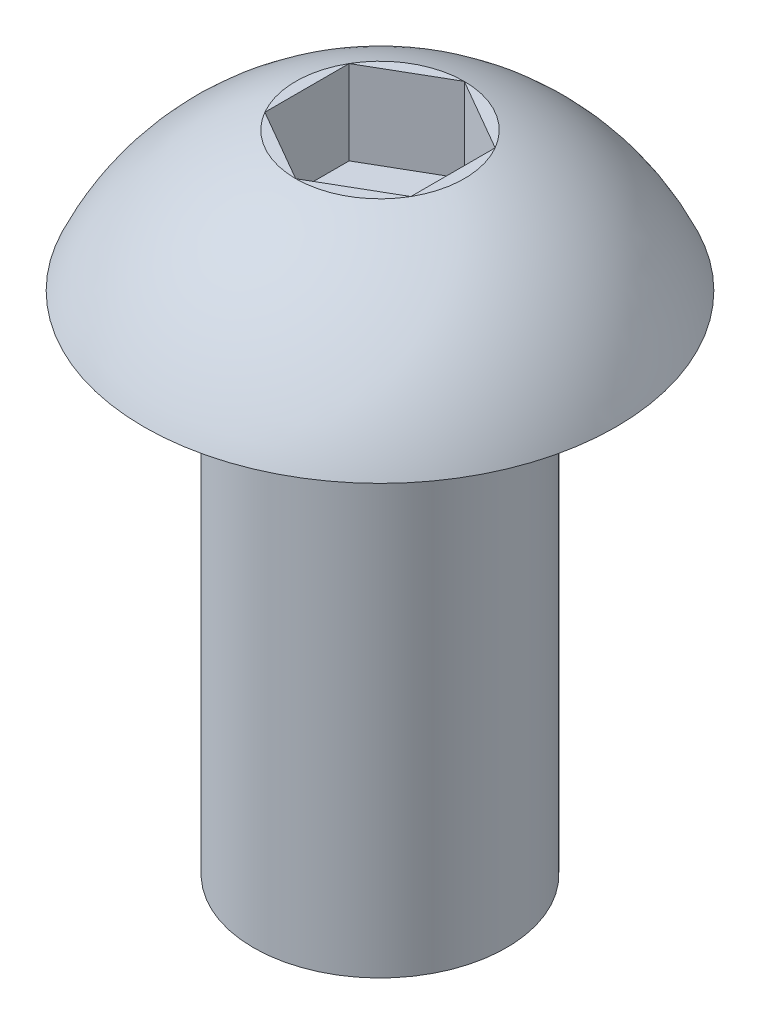
ISO-10303-21;
HEADER;
FILE_DESCRIPTION(('STEP AP214'),'2;1');
FILE_NAME('part.step','',(''),(''),'','','');
FILE_SCHEMA(('AUTOMOTIVE_DESIGN { 1 0 10303 214 1 1 1 1 }'));
ENDSEC;
DATA;
#1=APPLICATION_CONTEXT('core data for automotive mechanical design processes');
#2=APPLICATION_PROTOCOL_DEFINITION('international standard','automotive_design',2000,#1);
#3=PRODUCT_CONTEXT('',#1,'mechanical');
#4=PRODUCT('Part','Part','',(#3));
#5=PRODUCT_RELATED_PRODUCT_CATEGORY('part','',(#4));
#6=PRODUCT_DEFINITION_FORMATION('','',#4);
#7=PRODUCT_DEFINITION_CONTEXT('part definition',#1,'design');
#8=PRODUCT_DEFINITION('design','',#6,#7);
#9=PRODUCT_DEFINITION_SHAPE('','',#8);
#10=(LENGTH_UNIT() NAMED_UNIT(*) SI_UNIT(.MILLI.,.METRE.));
#11=(NAMED_UNIT(*) PLANE_ANGLE_UNIT() SI_UNIT($,.RADIAN.));
#12=(NAMED_UNIT(*) SI_UNIT($,.STERADIAN.) SOLID_ANGLE_UNIT());
#13=UNCERTAINTY_MEASURE_WITH_UNIT(LENGTH_MEASURE(1.E-05),#10,'distance_accuracy_value','');
#14=(GEOMETRIC_REPRESENTATION_CONTEXT(3) GLOBAL_UNCERTAINTY_ASSIGNED_CONTEXT((#13)) GLOBAL_UNIT_ASSIGNED_CONTEXT((#10,
#11,#12)) REPRESENTATION_CONTEXT('',''));
#15=CARTESIAN_POINT('',(0.,0.,0.));
#16=DIRECTION('',(0.,0.,1.));
#17=DIRECTION('',(1.,0.,0.));
#18=AXIS2_PLACEMENT_3D('',#15,#16,#17);
#19=CARTESIAN_POINT('',(0.,1.65,0.));
#20=DIRECTION('',(0.,1.,0.));
#21=DIRECTION('',(0.,0.,1.));
#22=AXIS2_PLACEMENT_3D('',#19,#20,#21);
#23=PLANE('',#22);
#24=DIRECTION('',(-0.866025403784439,0.,-0.5));
#25=VECTOR('',#24,1.);
#26=CARTESIAN_POINT('',(0.866025403784438,1.65,-0.5));
#27=LINE('',#26,#25);
#28=CARTESIAN_POINT('',(0.866025403784438,1.65,-0.5));
#29=VERTEX_POINT('',#28);
#30=CARTESIAN_POINT('',(0.,1.65,-1.));
#31=VERTEX_POINT('',#30);
#32=EDGE_CURVE('E48',#29,#31,#27,.T.);
#33=ORIENTED_EDGE('',*,*,#32,.F.);
#34=CARTESIAN_POINT('',(0.,1.65,0.));
#35=DIRECTION('',(0.,1.,0.));
#36=DIRECTION('',(0.,0.,1.));
#37=AXIS2_PLACEMENT_3D('',#34,#35,#36);
#38=CIRCLE('',#37,1.);
#39=EDGE_CURVE('E150',#29,#31,#38,.T.);
#40=ORIENTED_EDGE('',*,*,#39,.T.);
#41=EDGE_LOOP('',(#33,#40));
#42=FACE_BOUND('',#41,.T.);
#43=ADVANCED_FACE('F32',(#42),#23,.T.);
#44=DIRECTION('',(0.,0.,-1.));
#45=VECTOR('',#44,1.);
#46=CARTESIAN_POINT('',(0.866025403784439,1.65,0.5));
#47=LINE('',#46,#45);
#48=CARTESIAN_POINT('',(0.866025403784439,1.65,0.5));
#49=VERTEX_POINT('',#48);
#50=EDGE_CURVE('E131',#49,#29,#47,.T.);
#51=ORIENTED_EDGE('',*,*,#50,.F.);
#52=EDGE_CURVE('E145',#49,#29,#38,.T.);
#53=ORIENTED_EDGE('',*,*,#52,.T.);
#54=EDGE_LOOP('',(#51,#53));
#55=FACE_BOUND('',#54,.T.);
#56=ADVANCED_FACE('F173',(#55),#23,.T.);
#57=DIRECTION('',(0.866025403784439,0.,-0.5));
#58=VECTOR('',#57,1.);
#59=CARTESIAN_POINT('',(0.,1.65,1.));
#60=LINE('',#59,#58);
#61=CARTESIAN_POINT('',(0.,1.65,1.));
#62=VERTEX_POINT('',#61);
#63=EDGE_CURVE('E129',#62,#49,#60,.T.);
#64=ORIENTED_EDGE('',*,*,#63,.F.);
#65=EDGE_CURVE('E143',#62,#49,#38,.T.);
#66=ORIENTED_EDGE('',*,*,#65,.T.);
#67=EDGE_LOOP('',(#64,#66));
#68=FACE_BOUND('',#67,.T.);
#69=ADVANCED_FACE('F175',(#68),#23,.T.);
#70=DIRECTION('',(0.866025403784439,0.,0.5));
#71=VECTOR('',#70,1.);
#72=CARTESIAN_POINT('',(-0.866025403784439,1.65,0.5));
#73=LINE('',#72,#71);
#74=CARTESIAN_POINT('',(-0.866025403784439,1.65,0.5));
#75=VERTEX_POINT('',#74);
#76=EDGE_CURVE('E96',#75,#62,#73,.T.);
#77=ORIENTED_EDGE('',*,*,#76,.F.);
#78=EDGE_CURVE('E142',#75,#62,#38,.T.);
#79=ORIENTED_EDGE('',*,*,#78,.T.);
#80=EDGE_LOOP('',(#77,#79));
#81=FACE_BOUND('',#80,.T.);
#82=ADVANCED_FACE('F177',(#81),#23,.T.);
#83=DIRECTION('',(0.,0.,1.));
#84=VECTOR('',#83,1.);
#85=CARTESIAN_POINT('',(-0.866025403784439,1.65,-0.5));
#86=LINE('',#85,#84);
#87=CARTESIAN_POINT('',(-0.866025403784439,1.65,-0.5));
#88=VERTEX_POINT('',#87);
#89=EDGE_CURVE('E125',#88,#75,#86,.T.);
#90=ORIENTED_EDGE('',*,*,#89,.F.);
#91=EDGE_CURVE('E152',#88,#75,#38,.T.);
#92=ORIENTED_EDGE('',*,*,#91,.T.);
#93=EDGE_LOOP('',(#90,#92));
#94=FACE_BOUND('',#93,.T.);
#95=ADVANCED_FACE('F183',(#94),#23,.T.);
#96=CARTESIAN_POINT('',(0.,0.,0.));
#97=DIRECTION('',(0.,1.,0.));
#98=DIRECTION('',(0.,0.,1.));
#99=AXIS2_PLACEMENT_3D('',#96,#97,#98);
#100=PLANE('',#99);
#101=CARTESIAN_POINT('',(0.,0.,0.));
#102=DIRECTION('',(0.,-1.,0.));
#103=DIRECTION('',(0.,0.,-1.));
#104=AXIS2_PLACEMENT_3D('',#101,#102,#103);
#105=CIRCLE('',#104,1.5);
#106=CARTESIAN_POINT('',(0.,0.,-1.5));
#107=VERTEX_POINT('',#106);
#108=EDGE_CURVE('E11',#107,#107,#105,.T.);
#109=ORIENTED_EDGE('',*,*,#108,.F.);
#110=EDGE_LOOP('',(#109));
#111=FACE_BOUND('',#110,.T.);
#112=CARTESIAN_POINT('',(0.,0.,0.));
#113=DIRECTION('',(0.,1.,0.));
#114=DIRECTION('',(0.,0.,1.));
#115=AXIS2_PLACEMENT_3D('',#112,#113,#114);
#116=CIRCLE('',#115,2.8);
#117=CARTESIAN_POINT('',(0.,0.,2.8));
#118=VERTEX_POINT('',#117);
#119=EDGE_CURVE('E36',#118,#118,#116,.T.);
#120=ORIENTED_EDGE('',*,*,#119,.F.);
#121=EDGE_LOOP('',(#120));
#122=FACE_BOUND('',#121,.T.);
#123=ADVANCED_FACE('F34',(#111,#122),#100,.F.);
#124=CARTESIAN_POINT('',(0.,-1.19504109803139,0.));
#125=DIRECTION('',(0.,1.,0.));
#126=DIRECTION('',(0.,0.,1.));
#127=AXIS2_PLACEMENT_3D('',#124,#125,#126);
#128=DEGENERATE_TOROIDAL_SURFACE('',#127,0.0482956601378954,3.,.T.);
#129=ORIENTED_EDGE('',*,*,#65,.F.);
#130=ORIENTED_EDGE('',*,*,#78,.F.);
#131=ORIENTED_EDGE('',*,*,#91,.F.);
#132=EDGE_CURVE('E156',#31,#88,#38,.T.);
#133=ORIENTED_EDGE('',*,*,#132,.F.);
#134=ORIENTED_EDGE('',*,*,#39,.F.);
#135=ORIENTED_EDGE('',*,*,#52,.F.);
#136=EDGE_LOOP('',(#129,#130,#131,#133,#134,#135));
#137=FACE_BOUND('',#136,.T.);
#138=ORIENTED_EDGE('',*,*,#119,.T.);
#139=EDGE_LOOP('',(#138));
#140=FACE_BOUND('',#139,.T.);
#141=ADVANCED_FACE('F169',(#137,#140),#128,.T.);
#142=DIRECTION('',(-0.866025403784438,0.,0.5));
#143=VECTOR('',#142,1.);
#144=CARTESIAN_POINT('',(0.,1.65,-1.));
#145=LINE('',#144,#143);
#146=EDGE_CURVE('E122',#31,#88,#145,.T.);
#147=ORIENTED_EDGE('',*,*,#146,.F.);
#148=ORIENTED_EDGE('',*,*,#132,.T.);
#149=EDGE_LOOP('',(#147,#148));
#150=FACE_BOUND('',#149,.T.);
#151=ADVANCED_FACE('F184',(#150),#23,.T.);
#152=CARTESIAN_POINT('',(0.,-6.,0.));
#153=DIRECTION('',(0.,1.,0.));
#154=DIRECTION('',(0.,0.,1.));
#155=AXIS2_PLACEMENT_3D('',#152,#153,#154);
#156=CYLINDRICAL_SURFACE('',#155,1.5);
#157=CARTESIAN_POINT('',(0.,-6.,0.));
#158=DIRECTION('',(0.,-1.,0.));
#159=DIRECTION('',(0.,0.,-1.));
#160=AXIS2_PLACEMENT_3D('',#157,#158,#159);
#161=CIRCLE('',#160,1.5);
#162=CARTESIAN_POINT('',(0.,-6.,-1.5));
#163=VERTEX_POINT('',#162);
#164=EDGE_CURVE('E135',#163,#163,#161,.T.);
#165=ORIENTED_EDGE('',*,*,#164,.F.);
#166=EDGE_LOOP('',(#165));
#167=FACE_BOUND('',#166,.T.);
#168=ORIENTED_EDGE('',*,*,#108,.T.);
#169=EDGE_LOOP('',(#168));
#170=FACE_BOUND('',#169,.T.);
#171=ADVANCED_FACE('F190',(#167,#170),#156,.T.);
#172=CARTESIAN_POINT('',(0.,-6.,0.));
#173=DIRECTION('',(0.,-1.,0.));
#174=DIRECTION('',(0.,0.,-1.));
#175=AXIS2_PLACEMENT_3D('',#172,#173,#174);
#176=PLANE('',#175);
#177=ORIENTED_EDGE('',*,*,#164,.T.);
#178=EDGE_LOOP('',(#177));
#179=FACE_BOUND('',#178,.T.);
#180=ADVANCED_FACE('F195',(#179),#176,.T.);
#181=CARTESIAN_POINT('',(0.866025403784438,0.65,-0.5));
#182=DIRECTION('',(0.5,0.,-0.866025403784439));
#183=DIRECTION('',(-0.866025403784439,0.,-0.5));
#184=AXIS2_PLACEMENT_3D('',#181,#182,#183);
#185=PLANE('',#184);
#186=ORIENTED_EDGE('',*,*,#32,.T.);
#187=DIRECTION('',(0.,1.,0.));
#188=VECTOR('',#187,1.);
#189=CARTESIAN_POINT('',(0.,0.65,-1.));
#190=LINE('',#189,#188);
#191=CARTESIAN_POINT('',(0.,0.65,-1.));
#192=VERTEX_POINT('',#191);
#193=EDGE_CURVE('E78',#192,#31,#190,.T.);
#194=ORIENTED_EDGE('',*,*,#193,.F.);
#195=DIRECTION('',(-0.866025403784439,0.,-0.5));
#196=VECTOR('',#195,1.);
#197=CARTESIAN_POINT('',(0.866025403784438,0.65,-0.5));
#198=LINE('',#197,#196);
#199=CARTESIAN_POINT('',(0.866025403784438,0.65,-0.5));
#200=VERTEX_POINT('',#199);
#201=EDGE_CURVE('E133',#200,#192,#198,.T.);
#202=ORIENTED_EDGE('',*,*,#201,.F.);
#203=DIRECTION('',(0.,1.,0.));
#204=VECTOR('',#203,1.);
#205=CARTESIAN_POINT('',(0.866025403784438,0.65,-0.5));
#206=LINE('',#205,#204);
#207=EDGE_CURVE('E56',#200,#29,#206,.T.);
#208=ORIENTED_EDGE('',*,*,#207,.T.);
#209=EDGE_LOOP('',(#186,#194,#202,#208));
#210=FACE_BOUND('',#209,.T.);
#211=ADVANCED_FACE('F207',(#210),#185,.F.);
#212=CARTESIAN_POINT('',(0.866025403784439,0.65,0.5));
#213=DIRECTION('',(1.,0.,0.));
#214=DIRECTION('',(0.,0.,-1.));
#215=AXIS2_PLACEMENT_3D('',#212,#213,#214);
#216=PLANE('',#215);
#217=ORIENTED_EDGE('',*,*,#50,.T.);
#218=ORIENTED_EDGE('',*,*,#207,.F.);
#219=DIRECTION('',(0.,0.,-1.));
#220=VECTOR('',#219,1.);
#221=CARTESIAN_POINT('',(0.866025403784439,0.65,0.5));
#222=LINE('',#221,#220);
#223=CARTESIAN_POINT('',(0.866025403784439,0.65,0.5));
#224=VERTEX_POINT('',#223);
#225=EDGE_CURVE('E108',#224,#200,#222,.T.);
#226=ORIENTED_EDGE('',*,*,#225,.F.);
#227=DIRECTION('',(0.,1.,0.));
#228=VECTOR('',#227,1.);
#229=CARTESIAN_POINT('',(0.866025403784439,0.65,0.5));
#230=LINE('',#229,#228);
#231=EDGE_CURVE('E100',#224,#49,#230,.T.);
#232=ORIENTED_EDGE('',*,*,#231,.T.);
#233=EDGE_LOOP('',(#217,#218,#226,#232));
#234=FACE_BOUND('',#233,.T.);
#235=ADVANCED_FACE('F174',(#234),#216,.F.);
#236=CARTESIAN_POINT('',(0.,0.65,1.));
#237=DIRECTION('',(0.5,0.,0.866025403784439));
#238=DIRECTION('',(0.866025403784439,0.,-0.5));
#239=AXIS2_PLACEMENT_3D('',#236,#237,#238);
#240=PLANE('',#239);
#241=ORIENTED_EDGE('',*,*,#63,.T.);
#242=ORIENTED_EDGE('',*,*,#231,.F.);
#243=DIRECTION('',(0.866025403784439,0.,-0.5));
#244=VECTOR('',#243,1.);
#245=CARTESIAN_POINT('',(0.,0.65,1.));
#246=LINE('',#245,#244);
#247=CARTESIAN_POINT('',(0.,0.65,1.));
#248=VERTEX_POINT('',#247);
#249=EDGE_CURVE('E104',#248,#224,#246,.T.);
#250=ORIENTED_EDGE('',*,*,#249,.F.);
#251=DIRECTION('',(0.,1.,0.));
#252=VECTOR('',#251,1.);
#253=CARTESIAN_POINT('',(0.,0.65,1.));
#254=LINE('',#253,#252);
#255=EDGE_CURVE('E89',#248,#62,#254,.T.);
#256=ORIENTED_EDGE('',*,*,#255,.T.);
#257=EDGE_LOOP('',(#241,#242,#250,#256));
#258=FACE_BOUND('',#257,.T.);
#259=ADVANCED_FACE('F105',(#258),#240,.F.);
#260=CARTESIAN_POINT('',(-0.866025403784439,0.65,0.5));
#261=DIRECTION('',(-0.5,0.,0.866025403784439));
#262=DIRECTION('',(0.866025403784439,0.,0.5));
#263=AXIS2_PLACEMENT_3D('',#260,#261,#262);
#264=PLANE('',#263);
#265=ORIENTED_EDGE('',*,*,#76,.T.);
#266=ORIENTED_EDGE('',*,*,#255,.F.);
#267=DIRECTION('',(0.866025403784439,0.,0.5));
#268=VECTOR('',#267,1.);
#269=CARTESIAN_POINT('',(-0.866025403784439,0.65,0.5));
#270=LINE('',#269,#268);
#271=CARTESIAN_POINT('',(-0.866025403784439,0.65,0.5));
#272=VERTEX_POINT('',#271);
#273=EDGE_CURVE('E93',#272,#248,#270,.T.);
#274=ORIENTED_EDGE('',*,*,#273,.F.);
#275=DIRECTION('',(0.,1.,0.));
#276=VECTOR('',#275,1.);
#277=CARTESIAN_POINT('',(-0.866025403784439,0.65,0.5));
#278=LINE('',#277,#276);
#279=EDGE_CURVE('E101',#272,#75,#278,.T.);
#280=ORIENTED_EDGE('',*,*,#279,.T.);
#281=EDGE_LOOP('',(#265,#266,#274,#280));
#282=FACE_BOUND('',#281,.T.);
#283=ADVANCED_FACE('F91',(#282),#264,.F.);
#284=CARTESIAN_POINT('',(-0.866025403784439,0.65,-0.5));
#285=DIRECTION('',(-1.,0.,0.));
#286=DIRECTION('',(0.,0.,1.));
#287=AXIS2_PLACEMENT_3D('',#284,#285,#286);
#288=PLANE('',#287);
#289=ORIENTED_EDGE('',*,*,#89,.T.);
#290=ORIENTED_EDGE('',*,*,#279,.F.);
#291=DIRECTION('',(0.,0.,1.));
#292=VECTOR('',#291,1.);
#293=CARTESIAN_POINT('',(-0.866025403784439,0.65,-0.5));
#294=LINE('',#293,#292);
#295=CARTESIAN_POINT('',(-0.866025403784439,0.65,-0.5));
#296=VERTEX_POINT('',#295);
#297=EDGE_CURVE('E114',#296,#272,#294,.T.);
#298=ORIENTED_EDGE('',*,*,#297,.F.);
#299=DIRECTION('',(0.,1.,0.));
#300=VECTOR('',#299,1.);
#301=CARTESIAN_POINT('',(-0.866025403784439,0.65,-0.5));
#302=LINE('',#301,#300);
#303=EDGE_CURVE('E138',#296,#88,#302,.T.);
#304=ORIENTED_EDGE('',*,*,#303,.T.);
#305=EDGE_LOOP('',(#289,#290,#298,#304));
#306=FACE_BOUND('',#305,.T.);
#307=ADVANCED_FACE('F203',(#306),#288,.F.);
#308=CARTESIAN_POINT('',(0.,0.65,-1.));
#309=DIRECTION('',(-0.5,0.,-0.866025403784439));
#310=DIRECTION('',(-0.866025403784438,0.,0.5));
#311=AXIS2_PLACEMENT_3D('',#308,#309,#310);
#312=PLANE('',#311);
#313=ORIENTED_EDGE('',*,*,#146,.T.);
#314=ORIENTED_EDGE('',*,*,#303,.F.);
#315=DIRECTION('',(-0.866025403784438,0.,0.5));
#316=VECTOR('',#315,1.);
#317=CARTESIAN_POINT('',(0.,0.65,-1.));
#318=LINE('',#317,#316);
#319=EDGE_CURVE('E116',#192,#296,#318,.T.);
#320=ORIENTED_EDGE('',*,*,#319,.F.);
#321=ORIENTED_EDGE('',*,*,#193,.T.);
#322=EDGE_LOOP('',(#313,#314,#320,#321));
#323=FACE_BOUND('',#322,.T.);
#324=ADVANCED_FACE('F205',(#323),#312,.F.);
#325=CARTESIAN_POINT('',(0.,0.65,0.));
#326=DIRECTION('',(0.,1.,0.));
#327=DIRECTION('',(0.,0.,1.));
#328=AXIS2_PLACEMENT_3D('',#325,#326,#327);
#329=PLANE('',#328);
#330=ORIENTED_EDGE('',*,*,#201,.T.);
#331=ORIENTED_EDGE('',*,*,#319,.T.);
#332=ORIENTED_EDGE('',*,*,#297,.T.);
#333=ORIENTED_EDGE('',*,*,#273,.T.);
#334=ORIENTED_EDGE('',*,*,#249,.T.);
#335=ORIENTED_EDGE('',*,*,#225,.T.);
#336=EDGE_LOOP('',(#330,#331,#332,#333,#334,#335));
#337=FACE_BOUND('',#336,.T.);
#338=ADVANCED_FACE('F111',(#337),#329,.T.);
#339=CLOSED_SHELL('',(#43,#56,#69,#82,#95,#123,#141,#151,#171,#180,#211,#235,#259,#283,#307,
#324,#338));
#340=MANIFOLD_SOLID_BREP('B2',#339);
#341=ADVANCED_BREP_SHAPE_REPRESENTATION('',(#18,#340),#14);
#342=SHAPE_DEFINITION_REPRESENTATION(#9,#341);
ENDSEC;
END-ISO-10303-21;
